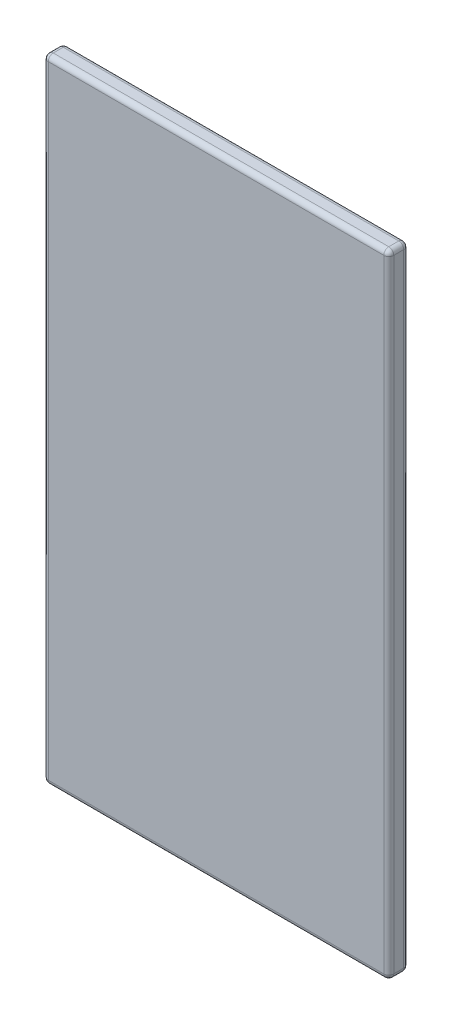
ISO-10303-21;
HEADER;
FILE_DESCRIPTION(('STEP AP214'),'2;1');
FILE_NAME('part.step','',(''),(''),'','','');
FILE_SCHEMA(('AUTOMOTIVE_DESIGN { 1 0 10303 214 1 1 1 1 }'));
ENDSEC;
DATA;
#1=APPLICATION_CONTEXT('core data for automotive mechanical design processes');
#2=APPLICATION_PROTOCOL_DEFINITION('international standard','automotive_design',2000,#1);
#3=PRODUCT_CONTEXT('',#1,'mechanical');
#4=PRODUCT('Part','Part','',(#3));
#5=PRODUCT_RELATED_PRODUCT_CATEGORY('part','',(#4));
#6=PRODUCT_DEFINITION_FORMATION('','',#4);
#7=PRODUCT_DEFINITION_CONTEXT('part definition',#1,'design');
#8=PRODUCT_DEFINITION('design','',#6,#7);
#9=PRODUCT_DEFINITION_SHAPE('','',#8);
#10=(LENGTH_UNIT() NAMED_UNIT(*) SI_UNIT(.MILLI.,.METRE.));
#11=(NAMED_UNIT(*) PLANE_ANGLE_UNIT() SI_UNIT($,.RADIAN.));
#12=(NAMED_UNIT(*) SI_UNIT($,.STERADIAN.) SOLID_ANGLE_UNIT());
#13=UNCERTAINTY_MEASURE_WITH_UNIT(LENGTH_MEASURE(1.E-05),#10,'distance_accuracy_value','');
#14=(GEOMETRIC_REPRESENTATION_CONTEXT(3) GLOBAL_UNCERTAINTY_ASSIGNED_CONTEXT((#13)) GLOBAL_UNIT_ASSIGNED_CONTEXT((#10,
#11,#12)) REPRESENTATION_CONTEXT('',''));
#15=CARTESIAN_POINT('',(0.,0.,0.));
#16=DIRECTION('',(0.,0.,1.));
#17=DIRECTION('',(1.,0.,0.));
#18=AXIS2_PLACEMENT_3D('',#15,#16,#17);
#19=CARTESIAN_POINT('',(17.35,-31.75,2.));
#20=DIRECTION('',(-1.,0.,0.));
#21=DIRECTION('',(0.,0.,1.));
#22=AXIS2_PLACEMENT_3D('',#19,#20,#21);
#23=PLANE('',#22);
#24=DIRECTION('',(0.,1.,0.));
#25=VECTOR('',#24,1.);
#26=CARTESIAN_POINT('',(17.35,-31.75,1.5));
#27=LINE('',#26,#25);
#28=CARTESIAN_POINT('',(17.35,31.25,1.5));
#29=VERTEX_POINT('',#28);
#30=CARTESIAN_POINT('',(17.35,-31.25,1.5));
#31=VERTEX_POINT('',#30);
#32=EDGE_CURVE('E42',#29,#31,#27,.F.);
#33=ORIENTED_EDGE('',*,*,#32,.T.);
#34=DIRECTION('',(0.,0.,-1.));
#35=VECTOR('',#34,1.);
#36=CARTESIAN_POINT('',(17.35,-31.25,2.));
#37=LINE('',#36,#35);
#38=CARTESIAN_POINT('',(17.35,-31.25,0.5));
#39=VERTEX_POINT('',#38);
#40=EDGE_CURVE('E11',#31,#39,#37,.T.);
#41=ORIENTED_EDGE('',*,*,#40,.T.);
#42=DIRECTION('',(0.,1.,0.));
#43=VECTOR('',#42,1.);
#44=CARTESIAN_POINT('',(17.35,31.75,0.5));
#45=LINE('',#44,#43);
#46=CARTESIAN_POINT('',(17.35,31.25,0.5));
#47=VERTEX_POINT('',#46);
#48=EDGE_CURVE('E194',#39,#47,#45,.T.);
#49=ORIENTED_EDGE('',*,*,#48,.T.);
#50=DIRECTION('',(0.,0.,-1.));
#51=VECTOR('',#50,1.);
#52=CARTESIAN_POINT('',(17.35,31.25,2.));
#53=LINE('',#52,#51);
#54=EDGE_CURVE('E53',#47,#29,#53,.F.);
#55=ORIENTED_EDGE('',*,*,#54,.T.);
#56=EDGE_LOOP('',(#33,#41,#49,#55));
#57=FACE_BOUND('',#56,.T.);
#58=ADVANCED_FACE('F33',(#57),#23,.F.);
#59=CARTESIAN_POINT('',(-17.35,31.75,2.));
#60=DIRECTION('',(0.,-1.,0.));
#61=DIRECTION('',(0.,0.,-1.));
#62=AXIS2_PLACEMENT_3D('',#59,#60,#61);
#63=PLANE('',#62);
#64=DIRECTION('',(0.,0.,-1.));
#65=VECTOR('',#64,1.);
#66=CARTESIAN_POINT('',(-16.85,31.75,2.));
#67=LINE('',#66,#65);
#68=CARTESIAN_POINT('',(-16.85,31.75,0.5));
#69=VERTEX_POINT('',#68);
#70=CARTESIAN_POINT('',(-16.85,31.75,1.5));
#71=VERTEX_POINT('',#70);
#72=EDGE_CURVE('E189',#69,#71,#67,.F.);
#73=ORIENTED_EDGE('',*,*,#72,.T.);
#74=DIRECTION('',(-1.,0.,0.));
#75=VECTOR('',#74,1.);
#76=CARTESIAN_POINT('',(-17.35,31.75,1.5));
#77=LINE('',#76,#75);
#78=CARTESIAN_POINT('',(16.85,31.75,1.5));
#79=VERTEX_POINT('',#78);
#80=EDGE_CURVE('E191',#71,#79,#77,.F.);
#81=ORIENTED_EDGE('',*,*,#80,.T.);
#82=DIRECTION('',(0.,0.,-1.));
#83=VECTOR('',#82,1.);
#84=CARTESIAN_POINT('',(16.85,31.75,2.));
#85=LINE('',#84,#83);
#86=CARTESIAN_POINT('',(16.85,31.75,0.5));
#87=VERTEX_POINT('',#86);
#88=EDGE_CURVE('E185',#79,#87,#85,.T.);
#89=ORIENTED_EDGE('',*,*,#88,.T.);
#90=DIRECTION('',(-1.,0.,0.));
#91=VECTOR('',#90,1.);
#92=CARTESIAN_POINT('',(-17.35,31.75,0.5));
#93=LINE('',#92,#91);
#94=EDGE_CURVE('E187',#87,#69,#93,.T.);
#95=ORIENTED_EDGE('',*,*,#94,.T.);
#96=EDGE_LOOP('',(#73,#81,#89,#95));
#97=FACE_BOUND('',#96,.T.);
#98=ADVANCED_FACE('F278',(#97),#63,.F.);
#99=CARTESIAN_POINT('',(-17.35,-31.75,2.));
#100=DIRECTION('',(1.,0.,0.));
#101=DIRECTION('',(0.,0.,-1.));
#102=AXIS2_PLACEMENT_3D('',#99,#100,#101);
#103=PLANE('',#102);
#104=DIRECTION('',(0.,0.,-1.));
#105=VECTOR('',#104,1.);
#106=CARTESIAN_POINT('',(-17.35,-31.25,2.));
#107=LINE('',#106,#105);
#108=CARTESIAN_POINT('',(-17.35,-31.25,0.5));
#109=VERTEX_POINT('',#108);
#110=CARTESIAN_POINT('',(-17.35,-31.25,1.5));
#111=VERTEX_POINT('',#110);
#112=EDGE_CURVE('E180',#109,#111,#107,.F.);
#113=ORIENTED_EDGE('',*,*,#112,.T.);
#114=DIRECTION('',(0.,-1.,0.));
#115=VECTOR('',#114,1.);
#116=CARTESIAN_POINT('',(-17.35,-31.75,1.5));
#117=LINE('',#116,#115);
#118=CARTESIAN_POINT('',(-17.35,31.25,1.5));
#119=VERTEX_POINT('',#118);
#120=EDGE_CURVE('E182',#111,#119,#117,.F.);
#121=ORIENTED_EDGE('',*,*,#120,.T.);
#122=DIRECTION('',(0.,0.,-1.));
#123=VECTOR('',#122,1.);
#124=CARTESIAN_POINT('',(-17.35,31.25,2.));
#125=LINE('',#124,#123);
#126=CARTESIAN_POINT('',(-17.35,31.25,0.5));
#127=VERTEX_POINT('',#126);
#128=EDGE_CURVE('E176',#119,#127,#125,.T.);
#129=ORIENTED_EDGE('',*,*,#128,.T.);
#130=DIRECTION('',(0.,-1.,0.));
#131=VECTOR('',#130,1.);
#132=CARTESIAN_POINT('',(-17.35,-31.75,0.5));
#133=LINE('',#132,#131);
#134=EDGE_CURVE('E178',#127,#109,#133,.T.);
#135=ORIENTED_EDGE('',*,*,#134,.T.);
#136=EDGE_LOOP('',(#113,#121,#129,#135));
#137=FACE_BOUND('',#136,.T.);
#138=ADVANCED_FACE('F269',(#137),#103,.F.);
#139=CARTESIAN_POINT('',(-17.35,-31.75,2.));
#140=DIRECTION('',(0.,1.,0.));
#141=DIRECTION('',(0.,0.,1.));
#142=AXIS2_PLACEMENT_3D('',#139,#140,#141);
#143=PLANE('',#142);
#144=DIRECTION('',(1.,0.,0.));
#145=VECTOR('',#144,1.);
#146=CARTESIAN_POINT('',(-17.35,-31.75,1.5));
#147=LINE('',#146,#145);
#148=CARTESIAN_POINT('',(16.85,-31.75,1.5));
#149=VERTEX_POINT('',#148);
#150=CARTESIAN_POINT('',(-16.85,-31.75,1.5));
#151=VERTEX_POINT('',#150);
#152=EDGE_CURVE('E129',#149,#151,#147,.F.);
#153=ORIENTED_EDGE('',*,*,#152,.T.);
#154=DIRECTION('',(0.,0.,-1.));
#155=VECTOR('',#154,1.);
#156=CARTESIAN_POINT('',(-16.85,-31.75,2.));
#157=LINE('',#156,#155);
#158=CARTESIAN_POINT('',(-16.85,-31.75,0.5));
#159=VERTEX_POINT('',#158);
#160=EDGE_CURVE('E165',#151,#159,#157,.T.);
#161=ORIENTED_EDGE('',*,*,#160,.T.);
#162=DIRECTION('',(1.,0.,0.));
#163=VECTOR('',#162,1.);
#164=CARTESIAN_POINT('',(17.35,-31.75,0.5));
#165=LINE('',#164,#163);
#166=CARTESIAN_POINT('',(16.85,-31.75,0.5));
#167=VERTEX_POINT('',#166);
#168=EDGE_CURVE('E158',#159,#167,#165,.T.);
#169=ORIENTED_EDGE('',*,*,#168,.T.);
#170=DIRECTION('',(0.,0.,-1.));
#171=VECTOR('',#170,1.);
#172=CARTESIAN_POINT('',(16.85,-31.75,2.));
#173=LINE('',#172,#171);
#174=EDGE_CURVE('E156',#167,#149,#173,.F.);
#175=ORIENTED_EDGE('',*,*,#174,.T.);
#176=EDGE_LOOP('',(#153,#161,#169,#175));
#177=FACE_BOUND('',#176,.T.);
#178=ADVANCED_FACE('F356',(#177),#143,.F.);
#179=CARTESIAN_POINT('',(0.,0.,2.));
#180=DIRECTION('',(0.,0.,-1.));
#181=DIRECTION('',(-1.,0.,0.));
#182=AXIS2_PLACEMENT_3D('',#179,#180,#181);
#183=PLANE('',#182);
#184=DIRECTION('',(0.,-1.,0.));
#185=VECTOR('',#184,1.);
#186=CARTESIAN_POINT('',(-16.85,0.,2.));
#187=LINE('',#186,#185);
#188=CARTESIAN_POINT('',(-16.85,31.25,2.));
#189=VERTEX_POINT('',#188);
#190=CARTESIAN_POINT('',(-16.85,-31.25,2.));
#191=VERTEX_POINT('',#190);
#192=EDGE_CURVE('E154',#189,#191,#187,.T.);
#193=ORIENTED_EDGE('',*,*,#192,.T.);
#194=DIRECTION('',(1.,0.,0.));
#195=VECTOR('',#194,1.);
#196=CARTESIAN_POINT('',(0.,-31.25,2.));
#197=LINE('',#196,#195);
#198=CARTESIAN_POINT('',(16.85,-31.25,2.));
#199=VERTEX_POINT('',#198);
#200=EDGE_CURVE('E127',#191,#199,#197,.T.);
#201=ORIENTED_EDGE('',*,*,#200,.T.);
#202=DIRECTION('',(0.,1.,0.));
#203=VECTOR('',#202,1.);
#204=CARTESIAN_POINT('',(16.85,0.,2.));
#205=LINE('',#204,#203);
#206=CARTESIAN_POINT('',(16.85,31.25,2.));
#207=VERTEX_POINT('',#206);
#208=EDGE_CURVE('E144',#199,#207,#205,.T.);
#209=ORIENTED_EDGE('',*,*,#208,.T.);
#210=DIRECTION('',(-1.,0.,0.));
#211=VECTOR('',#210,1.);
#212=CARTESIAN_POINT('',(0.,31.25,2.));
#213=LINE('',#212,#211);
#214=EDGE_CURVE('E150',#207,#189,#213,.T.);
#215=ORIENTED_EDGE('',*,*,#214,.T.);
#216=EDGE_LOOP('',(#193,#201,#209,#215));
#217=FACE_BOUND('',#216,.T.);
#218=ADVANCED_FACE('F152',(#217),#183,.F.);
#219=CARTESIAN_POINT('',(0.,0.,0.));
#220=DIRECTION('',(0.,0.,-1.));
#221=DIRECTION('',(-1.,0.,0.));
#222=AXIS2_PLACEMENT_3D('',#219,#220,#221);
#223=PLANE('',#222);
#224=DIRECTION('',(0.,1.,0.));
#225=VECTOR('',#224,1.);
#226=CARTESIAN_POINT('',(16.85,-31.75,0.));
#227=LINE('',#226,#225);
#228=CARTESIAN_POINT('',(16.85,31.25,0.));
#229=VERTEX_POINT('',#228);
#230=CARTESIAN_POINT('',(16.85,-31.25,0.));
#231=VERTEX_POINT('',#230);
#232=EDGE_CURVE('E167',#229,#231,#227,.F.);
#233=ORIENTED_EDGE('',*,*,#232,.T.);
#234=DIRECTION('',(1.,0.,0.));
#235=VECTOR('',#234,1.);
#236=CARTESIAN_POINT('',(-17.35,-31.25,0.));
#237=LINE('',#236,#235);
#238=CARTESIAN_POINT('',(-16.85,-31.25,0.));
#239=VERTEX_POINT('',#238);
#240=EDGE_CURVE('E173',#231,#239,#237,.F.);
#241=ORIENTED_EDGE('',*,*,#240,.T.);
#242=DIRECTION('',(0.,-1.,0.));
#243=VECTOR('',#242,1.);
#244=CARTESIAN_POINT('',(-16.85,31.75,0.));
#245=LINE('',#244,#243);
#246=CARTESIAN_POINT('',(-16.85,31.25,0.));
#247=VERTEX_POINT('',#246);
#248=EDGE_CURVE('E171',#239,#247,#245,.F.);
#249=ORIENTED_EDGE('',*,*,#248,.T.);
#250=DIRECTION('',(-1.,0.,0.));
#251=VECTOR('',#250,1.);
#252=CARTESIAN_POINT('',(17.35,31.25,0.));
#253=LINE('',#252,#251);
#254=EDGE_CURVE('E169',#247,#229,#253,.F.);
#255=ORIENTED_EDGE('',*,*,#254,.T.);
#256=EDGE_LOOP('',(#233,#241,#249,#255));
#257=FACE_BOUND('',#256,.T.);
#258=ADVANCED_FACE('F296',(#257),#223,.T.);
#259=CARTESIAN_POINT('',(-17.35,31.25,0.5));
#260=DIRECTION('',(1.,0.,0.));
#261=DIRECTION('',(0.,0.,-1.));
#262=AXIS2_PLACEMENT_3D('',#259,#260,#261);
#263=CYLINDRICAL_SURFACE('',#262,0.5);
#264=CARTESIAN_POINT('',(-16.85,31.25,0.5));
#265=DIRECTION('',(-1.,0.,0.));
#266=DIRECTION('',(0.,0.,1.));
#267=AXIS2_PLACEMENT_3D('',#264,#265,#266);
#268=CIRCLE('',#267,0.5);
#269=EDGE_CURVE('E37',#69,#247,#268,.T.);
#270=ORIENTED_EDGE('',*,*,#269,.F.);
#271=ORIENTED_EDGE('',*,*,#94,.F.);
#272=CARTESIAN_POINT('',(16.85,31.25,0.5));
#273=DIRECTION('',(1.,0.,0.));
#274=DIRECTION('',(0.,0.,-1.));
#275=AXIS2_PLACEMENT_3D('',#272,#273,#274);
#276=CIRCLE('',#275,0.5);
#277=EDGE_CURVE('E246',#229,#87,#276,.T.);
#278=ORIENTED_EDGE('',*,*,#277,.F.);
#279=ORIENTED_EDGE('',*,*,#254,.F.);
#280=EDGE_LOOP('',(#270,#271,#278,#279));
#281=FACE_BOUND('',#280,.T.);
#282=ADVANCED_FACE('F35',(#281),#263,.T.);
#283=CARTESIAN_POINT('',(-16.85,31.25,0.5));
#284=DIRECTION('',(0.,0.,1.));
#285=DIRECTION('',(1.,0.,0.));
#286=AXIS2_PLACEMENT_3D('',#283,#284,#285);
#287=SPHERICAL_SURFACE('',#286,0.5);
#288=CARTESIAN_POINT('',(-16.85,31.25,0.5));
#289=DIRECTION('',(0.,0.,-1.));
#290=DIRECTION('',(-1.,0.,0.));
#291=AXIS2_PLACEMENT_3D('',#288,#289,#290);
#292=CIRCLE('',#291,0.5);
#293=EDGE_CURVE('E241',#69,#127,#292,.F.);
#294=ORIENTED_EDGE('',*,*,#293,.F.);
#295=ORIENTED_EDGE('',*,*,#269,.T.);
#296=CARTESIAN_POINT('',(-16.85,31.25,0.5));
#297=DIRECTION('',(0.,1.,0.));
#298=DIRECTION('',(0.,0.,1.));
#299=AXIS2_PLACEMENT_3D('',#296,#297,#298);
#300=CIRCLE('',#299,0.5);
#301=EDGE_CURVE('E244',#127,#247,#300,.F.);
#302=ORIENTED_EDGE('',*,*,#301,.F.);
#303=EDGE_LOOP('',(#294,#295,#302));
#304=FACE_BOUND('',#303,.T.);
#305=ADVANCED_FACE('F257',(#304),#287,.T.);
#306=CARTESIAN_POINT('',(16.85,31.25,0.5));
#307=DIRECTION('',(0.,0.,1.));
#308=DIRECTION('',(1.,0.,0.));
#309=AXIS2_PLACEMENT_3D('',#306,#307,#308);
#310=SPHERICAL_SURFACE('',#309,0.5);
#311=CARTESIAN_POINT('',(16.85,31.25,0.5));
#312=DIRECTION('',(0.,1.,0.));
#313=DIRECTION('',(0.,0.,1.));
#314=AXIS2_PLACEMENT_3D('',#311,#312,#313);
#315=CIRCLE('',#314,0.5);
#316=EDGE_CURVE('E235',#229,#47,#315,.F.);
#317=ORIENTED_EDGE('',*,*,#316,.F.);
#318=ORIENTED_EDGE('',*,*,#277,.T.);
#319=CARTESIAN_POINT('',(16.85,31.25,0.5));
#320=DIRECTION('',(0.,0.,-1.));
#321=DIRECTION('',(-1.,0.,0.));
#322=AXIS2_PLACEMENT_3D('',#319,#320,#321);
#323=CIRCLE('',#322,0.5);
#324=EDGE_CURVE('E238',#47,#87,#323,.F.);
#325=ORIENTED_EDGE('',*,*,#324,.F.);
#326=EDGE_LOOP('',(#317,#318,#325));
#327=FACE_BOUND('',#326,.T.);
#328=ADVANCED_FACE('F289',(#327),#310,.T.);
#329=CARTESIAN_POINT('',(-16.85,-31.75,0.5));
#330=DIRECTION('',(0.,1.,0.));
#331=DIRECTION('',(0.,0.,1.));
#332=AXIS2_PLACEMENT_3D('',#329,#330,#331);
#333=CYLINDRICAL_SURFACE('',#332,0.5);
#334=ORIENTED_EDGE('',*,*,#301,.T.);
#335=ORIENTED_EDGE('',*,*,#248,.F.);
#336=CARTESIAN_POINT('',(-16.85,-31.25,0.5));
#337=DIRECTION('',(0.,-1.,0.));
#338=DIRECTION('',(0.,0.,-1.));
#339=AXIS2_PLACEMENT_3D('',#336,#337,#338);
#340=CIRCLE('',#339,0.5);
#341=EDGE_CURVE('E230',#109,#239,#340,.T.);
#342=ORIENTED_EDGE('',*,*,#341,.F.);
#343=ORIENTED_EDGE('',*,*,#134,.F.);
#344=EDGE_LOOP('',(#334,#335,#342,#343));
#345=FACE_BOUND('',#344,.T.);
#346=ADVANCED_FACE('F265',(#345),#333,.T.);
#347=CARTESIAN_POINT('',(-16.85,31.25,2.));
#348=DIRECTION('',(0.,0.,-1.));
#349=DIRECTION('',(-1.,0.,0.));
#350=AXIS2_PLACEMENT_3D('',#347,#348,#349);
#351=CYLINDRICAL_SURFACE('',#350,0.5);
#352=ORIENTED_EDGE('',*,*,#293,.T.);
#353=ORIENTED_EDGE('',*,*,#128,.F.);
#354=CARTESIAN_POINT('',(-16.85,31.25,1.5));
#355=DIRECTION('',(0.,0.,1.));
#356=DIRECTION('',(1.,0.,0.));
#357=AXIS2_PLACEMENT_3D('',#354,#355,#356);
#358=CIRCLE('',#357,0.5);
#359=EDGE_CURVE('E227',#71,#119,#358,.T.);
#360=ORIENTED_EDGE('',*,*,#359,.F.);
#361=ORIENTED_EDGE('',*,*,#72,.F.);
#362=EDGE_LOOP('',(#352,#353,#360,#361));
#363=FACE_BOUND('',#362,.T.);
#364=ADVANCED_FACE('F275',(#363),#351,.T.);
#365=CARTESIAN_POINT('',(0.,31.25,1.5));
#366=DIRECTION('',(-1.,0.,0.));
#367=DIRECTION('',(0.,0.,1.));
#368=AXIS2_PLACEMENT_3D('',#365,#366,#367);
#369=CYLINDRICAL_SURFACE('',#368,0.5);
#370=CARTESIAN_POINT('',(16.85,31.25,1.5));
#371=DIRECTION('',(1.,0.,0.));
#372=DIRECTION('',(0.,0.,-1.));
#373=AXIS2_PLACEMENT_3D('',#370,#371,#372);
#374=CIRCLE('',#373,0.5);
#375=EDGE_CURVE('E221',#79,#207,#374,.T.);
#376=ORIENTED_EDGE('',*,*,#375,.F.);
#377=ORIENTED_EDGE('',*,*,#80,.F.);
#378=CARTESIAN_POINT('',(-16.85,31.25,1.5));
#379=DIRECTION('',(-1.,0.,0.));
#380=DIRECTION('',(0.,0.,1.));
#381=AXIS2_PLACEMENT_3D('',#378,#379,#380);
#382=CIRCLE('',#381,0.5);
#383=EDGE_CURVE('E224',#189,#71,#382,.T.);
#384=ORIENTED_EDGE('',*,*,#383,.F.);
#385=ORIENTED_EDGE('',*,*,#214,.F.);
#386=EDGE_LOOP('',(#376,#377,#384,#385));
#387=FACE_BOUND('',#386,.T.);
#388=ADVANCED_FACE('F282',(#387),#369,.T.);
#389=CARTESIAN_POINT('',(16.85,31.25,2.));
#390=DIRECTION('',(0.,0.,-1.));
#391=DIRECTION('',(-1.,0.,0.));
#392=AXIS2_PLACEMENT_3D('',#389,#390,#391);
#393=CYLINDRICAL_SURFACE('',#392,0.5);
#394=ORIENTED_EDGE('',*,*,#324,.T.);
#395=ORIENTED_EDGE('',*,*,#88,.F.);
#396=CARTESIAN_POINT('',(16.85,31.25,1.5));
#397=DIRECTION('',(0.,0.,1.));
#398=DIRECTION('',(1.,0.,0.));
#399=AXIS2_PLACEMENT_3D('',#396,#397,#398);
#400=CIRCLE('',#399,0.5);
#401=EDGE_CURVE('E219',#29,#79,#400,.T.);
#402=ORIENTED_EDGE('',*,*,#401,.F.);
#403=ORIENTED_EDGE('',*,*,#54,.F.);
#404=EDGE_LOOP('',(#394,#395,#402,#403));
#405=FACE_BOUND('',#404,.T.);
#406=ADVANCED_FACE('F287',(#405),#393,.T.);
#407=CARTESIAN_POINT('',(16.85,-31.75,0.5));
#408=DIRECTION('',(0.,-1.,0.));
#409=DIRECTION('',(0.,0.,-1.));
#410=AXIS2_PLACEMENT_3D('',#407,#408,#409);
#411=CYLINDRICAL_SURFACE('',#410,0.5);
#412=ORIENTED_EDGE('',*,*,#316,.T.);
#413=ORIENTED_EDGE('',*,*,#48,.F.);
#414=CARTESIAN_POINT('',(16.85,-31.25,0.5));
#415=DIRECTION('',(0.,-1.,0.));
#416=DIRECTION('',(0.,0.,-1.));
#417=AXIS2_PLACEMENT_3D('',#414,#415,#416);
#418=CIRCLE('',#417,0.5);
#419=EDGE_CURVE('E216',#231,#39,#418,.T.);
#420=ORIENTED_EDGE('',*,*,#419,.F.);
#421=ORIENTED_EDGE('',*,*,#232,.F.);
#422=EDGE_LOOP('',(#412,#413,#420,#421));
#423=FACE_BOUND('',#422,.T.);
#424=ADVANCED_FACE('F293',(#423),#411,.T.);
#425=CARTESIAN_POINT('',(-17.35,-31.25,0.5));
#426=DIRECTION('',(-1.,0.,0.));
#427=DIRECTION('',(0.,0.,1.));
#428=AXIS2_PLACEMENT_3D('',#425,#426,#427);
#429=CYLINDRICAL_SURFACE('',#428,0.5);
#430=CARTESIAN_POINT('',(-16.85,-31.25,0.5));
#431=DIRECTION('',(-1.,0.,0.));
#432=DIRECTION('',(0.,0.,1.));
#433=AXIS2_PLACEMENT_3D('',#430,#431,#432);
#434=CIRCLE('',#433,0.5);
#435=EDGE_CURVE('E232',#239,#159,#434,.T.);
#436=ORIENTED_EDGE('',*,*,#435,.F.);
#437=ORIENTED_EDGE('',*,*,#240,.F.);
#438=CARTESIAN_POINT('',(16.85,-31.25,0.5));
#439=DIRECTION('',(1.,0.,0.));
#440=DIRECTION('',(0.,0.,-1.));
#441=AXIS2_PLACEMENT_3D('',#438,#439,#440);
#442=CIRCLE('',#441,0.5);
#443=EDGE_CURVE('E213',#167,#231,#442,.T.);
#444=ORIENTED_EDGE('',*,*,#443,.F.);
#445=ORIENTED_EDGE('',*,*,#168,.F.);
#446=EDGE_LOOP('',(#436,#437,#444,#445));
#447=FACE_BOUND('',#446,.T.);
#448=ADVANCED_FACE('F300',(#447),#429,.T.);
#449=CARTESIAN_POINT('',(-16.85,-31.25,0.5));
#450=DIRECTION('',(0.,0.,1.));
#451=DIRECTION('',(1.,0.,0.));
#452=AXIS2_PLACEMENT_3D('',#449,#450,#451);
#453=SPHERICAL_SURFACE('',#452,0.5);
#454=ORIENTED_EDGE('',*,*,#341,.T.);
#455=ORIENTED_EDGE('',*,*,#435,.T.);
#456=CARTESIAN_POINT('',(-16.85,-31.25,0.5));
#457=DIRECTION('',(0.,0.,-1.));
#458=DIRECTION('',(-1.,0.,0.));
#459=AXIS2_PLACEMENT_3D('',#456,#457,#458);
#460=CIRCLE('',#459,0.5);
#461=EDGE_CURVE('E210',#109,#159,#460,.F.);
#462=ORIENTED_EDGE('',*,*,#461,.F.);
#463=EDGE_LOOP('',(#454,#455,#462));
#464=FACE_BOUND('',#463,.T.);
#465=ADVANCED_FACE('F304',(#464),#453,.T.);
#466=CARTESIAN_POINT('',(-16.85,31.25,1.5));
#467=DIRECTION('',(0.,0.,1.));
#468=DIRECTION('',(1.,0.,0.));
#469=AXIS2_PLACEMENT_3D('',#466,#467,#468);
#470=SPHERICAL_SURFACE('',#469,0.5);
#471=ORIENTED_EDGE('',*,*,#383,.T.);
#472=ORIENTED_EDGE('',*,*,#359,.T.);
#473=CARTESIAN_POINT('',(-16.85,31.25,1.5));
#474=DIRECTION('',(0.,1.,0.));
#475=DIRECTION('',(0.,0.,1.));
#476=AXIS2_PLACEMENT_3D('',#473,#474,#475);
#477=CIRCLE('',#476,0.5);
#478=EDGE_CURVE('E208',#189,#119,#477,.F.);
#479=ORIENTED_EDGE('',*,*,#478,.F.);
#480=EDGE_LOOP('',(#471,#472,#479));
#481=FACE_BOUND('',#480,.T.);
#482=ADVANCED_FACE('F315',(#481),#470,.T.);
#483=CARTESIAN_POINT('',(16.85,31.25,1.5));
#484=DIRECTION('',(0.,0.,1.));
#485=DIRECTION('',(1.,0.,0.));
#486=AXIS2_PLACEMENT_3D('',#483,#484,#485);
#487=SPHERICAL_SURFACE('',#486,0.5);
#488=ORIENTED_EDGE('',*,*,#401,.T.);
#489=ORIENTED_EDGE('',*,*,#375,.T.);
#490=CARTESIAN_POINT('',(16.85,31.25,1.5));
#491=DIRECTION('',(0.,1.,0.));
#492=DIRECTION('',(0.,0.,1.));
#493=AXIS2_PLACEMENT_3D('',#490,#491,#492);
#494=CIRCLE('',#493,0.5);
#495=EDGE_CURVE('E147',#29,#207,#494,.F.);
#496=ORIENTED_EDGE('',*,*,#495,.F.);
#497=EDGE_LOOP('',(#488,#489,#496));
#498=FACE_BOUND('',#497,.T.);
#499=ADVANCED_FACE('F317',(#498),#487,.T.);
#500=CARTESIAN_POINT('',(16.85,-31.25,0.5));
#501=DIRECTION('',(0.,0.,1.));
#502=DIRECTION('',(1.,0.,0.));
#503=AXIS2_PLACEMENT_3D('',#500,#501,#502);
#504=SPHERICAL_SURFACE('',#503,0.5);
#505=ORIENTED_EDGE('',*,*,#443,.T.);
#506=ORIENTED_EDGE('',*,*,#419,.T.);
#507=CARTESIAN_POINT('',(16.85,-31.25,0.5));
#508=DIRECTION('',(0.,0.,-1.));
#509=DIRECTION('',(-1.,0.,0.));
#510=AXIS2_PLACEMENT_3D('',#507,#508,#509);
#511=CIRCLE('',#510,0.5);
#512=EDGE_CURVE('E205',#167,#39,#511,.F.);
#513=ORIENTED_EDGE('',*,*,#512,.F.);
#514=EDGE_LOOP('',(#505,#506,#513));
#515=FACE_BOUND('',#514,.T.);
#516=ADVANCED_FACE('F323',(#515),#504,.T.);
#517=CARTESIAN_POINT('',(-16.85,-31.25,2.));
#518=DIRECTION('',(0.,0.,-1.));
#519=DIRECTION('',(-1.,0.,0.));
#520=AXIS2_PLACEMENT_3D('',#517,#518,#519);
#521=CYLINDRICAL_SURFACE('',#520,0.5);
#522=ORIENTED_EDGE('',*,*,#461,.T.);
#523=ORIENTED_EDGE('',*,*,#160,.F.);
#524=CARTESIAN_POINT('',(-16.85,-31.25,1.5));
#525=DIRECTION('',(0.,0.,1.));
#526=DIRECTION('',(1.,0.,0.));
#527=AXIS2_PLACEMENT_3D('',#524,#525,#526);
#528=CIRCLE('',#527,0.5);
#529=EDGE_CURVE('E202',#111,#151,#528,.T.);
#530=ORIENTED_EDGE('',*,*,#529,.F.);
#531=ORIENTED_EDGE('',*,*,#112,.F.);
#532=EDGE_LOOP('',(#522,#523,#530,#531));
#533=FACE_BOUND('',#532,.T.);
#534=ADVANCED_FACE('F307',(#533),#521,.T.);
#535=CARTESIAN_POINT('',(-16.85,0.,1.5));
#536=DIRECTION('',(0.,-1.,0.));
#537=DIRECTION('',(0.,0.,-1.));
#538=AXIS2_PLACEMENT_3D('',#535,#536,#537);
#539=CYLINDRICAL_SURFACE('',#538,0.5);
#540=ORIENTED_EDGE('',*,*,#478,.T.);
#541=ORIENTED_EDGE('',*,*,#120,.F.);
#542=CARTESIAN_POINT('',(-16.85,-31.25,1.5));
#543=DIRECTION('',(0.,-1.,0.));
#544=DIRECTION('',(0.,0.,-1.));
#545=AXIS2_PLACEMENT_3D('',#542,#543,#544);
#546=CIRCLE('',#545,0.5);
#547=EDGE_CURVE('E141',#191,#111,#546,.T.);
#548=ORIENTED_EDGE('',*,*,#547,.F.);
#549=ORIENTED_EDGE('',*,*,#192,.F.);
#550=EDGE_LOOP('',(#540,#541,#548,#549));
#551=FACE_BOUND('',#550,.T.);
#552=ADVANCED_FACE('F313',(#551),#539,.T.);
#553=CARTESIAN_POINT('',(16.85,0.,1.5));
#554=DIRECTION('',(0.,1.,0.));
#555=DIRECTION('',(0.,0.,1.));
#556=AXIS2_PLACEMENT_3D('',#553,#554,#555);
#557=CYLINDRICAL_SURFACE('',#556,0.5);
#558=ORIENTED_EDGE('',*,*,#495,.T.);
#559=ORIENTED_EDGE('',*,*,#208,.F.);
#560=CARTESIAN_POINT('',(16.85,-31.25,1.5));
#561=DIRECTION('',(0.,-1.,0.));
#562=DIRECTION('',(0.,0.,-1.));
#563=AXIS2_PLACEMENT_3D('',#560,#561,#562);
#564=CIRCLE('',#563,0.5);
#565=EDGE_CURVE('E135',#31,#199,#564,.T.);
#566=ORIENTED_EDGE('',*,*,#565,.F.);
#567=ORIENTED_EDGE('',*,*,#32,.F.);
#568=EDGE_LOOP('',(#558,#559,#566,#567));
#569=FACE_BOUND('',#568,.T.);
#570=ADVANCED_FACE('F145',(#569),#557,.T.);
#571=CARTESIAN_POINT('',(16.85,-31.25,2.));
#572=DIRECTION('',(0.,0.,-1.));
#573=DIRECTION('',(-1.,0.,0.));
#574=AXIS2_PLACEMENT_3D('',#571,#572,#573);
#575=CYLINDRICAL_SURFACE('',#574,0.5);
#576=ORIENTED_EDGE('',*,*,#512,.T.);
#577=ORIENTED_EDGE('',*,*,#40,.F.);
#578=CARTESIAN_POINT('',(16.85,-31.25,1.5));
#579=DIRECTION('',(0.,0.,1.));
#580=DIRECTION('',(1.,0.,0.));
#581=AXIS2_PLACEMENT_3D('',#578,#579,#580);
#582=CIRCLE('',#581,0.5);
#583=EDGE_CURVE('E139',#149,#31,#582,.T.);
#584=ORIENTED_EDGE('',*,*,#583,.F.);
#585=ORIENTED_EDGE('',*,*,#174,.F.);
#586=EDGE_LOOP('',(#576,#577,#584,#585));
#587=FACE_BOUND('',#586,.T.);
#588=ADVANCED_FACE('F340',(#587),#575,.T.);
#589=CARTESIAN_POINT('',(-16.85,-31.25,1.5));
#590=DIRECTION('',(0.,0.,1.));
#591=DIRECTION('',(1.,0.,0.));
#592=AXIS2_PLACEMENT_3D('',#589,#590,#591);
#593=SPHERICAL_SURFACE('',#592,0.5);
#594=ORIENTED_EDGE('',*,*,#547,.T.);
#595=ORIENTED_EDGE('',*,*,#529,.T.);
#596=CARTESIAN_POINT('',(-16.85,-31.25,1.5));
#597=DIRECTION('',(-1.,0.,0.));
#598=DIRECTION('',(0.,0.,1.));
#599=AXIS2_PLACEMENT_3D('',#596,#597,#598);
#600=CIRCLE('',#599,0.5);
#601=EDGE_CURVE('E132',#191,#151,#600,.F.);
#602=ORIENTED_EDGE('',*,*,#601,.F.);
#603=EDGE_LOOP('',(#594,#595,#602));
#604=FACE_BOUND('',#603,.T.);
#605=ADVANCED_FACE('F311',(#604),#593,.T.);
#606=CARTESIAN_POINT('',(16.85,-31.25,1.5));
#607=DIRECTION('',(0.,0.,1.));
#608=DIRECTION('',(1.,0.,0.));
#609=AXIS2_PLACEMENT_3D('',#606,#607,#608);
#610=SPHERICAL_SURFACE('',#609,0.5);
#611=ORIENTED_EDGE('',*,*,#583,.T.);
#612=ORIENTED_EDGE('',*,*,#565,.T.);
#613=CARTESIAN_POINT('',(16.85,-31.25,1.5));
#614=DIRECTION('',(1.,0.,0.));
#615=DIRECTION('',(0.,0.,-1.));
#616=AXIS2_PLACEMENT_3D('',#613,#614,#615);
#617=CIRCLE('',#616,0.5);
#618=EDGE_CURVE('E123',#149,#199,#617,.F.);
#619=ORIENTED_EDGE('',*,*,#618,.F.);
#620=EDGE_LOOP('',(#611,#612,#619));
#621=FACE_BOUND('',#620,.T.);
#622=ADVANCED_FACE('F137',(#621),#610,.T.);
#623=CARTESIAN_POINT('',(0.,-31.25,1.5));
#624=DIRECTION('',(1.,0.,0.));
#625=DIRECTION('',(0.,0.,-1.));
#626=AXIS2_PLACEMENT_3D('',#623,#624,#625);
#627=CYLINDRICAL_SURFACE('',#626,0.5);
#628=ORIENTED_EDGE('',*,*,#601,.T.);
#629=ORIENTED_EDGE('',*,*,#152,.F.);
#630=ORIENTED_EDGE('',*,*,#618,.T.);
#631=ORIENTED_EDGE('',*,*,#200,.F.);
#632=EDGE_LOOP('',(#628,#629,#630,#631));
#633=FACE_BOUND('',#632,.T.);
#634=ADVANCED_FACE('F125',(#633),#627,.T.);
#635=CLOSED_SHELL('',(#58,#98,#138,#178,#218,#258,#282,#305,#328,#346,#364,#388,#406,#424,#448,
#465,#482,#499,#516,#534,#552,#570,#588,#605,#622,#634));
#636=MANIFOLD_SOLID_BREP('B2',#635);
#637=ADVANCED_BREP_SHAPE_REPRESENTATION('',(#18,#636),#14);
#638=SHAPE_DEFINITION_REPRESENTATION(#9,#637);
ENDSEC;
END-ISO-10303-21;
